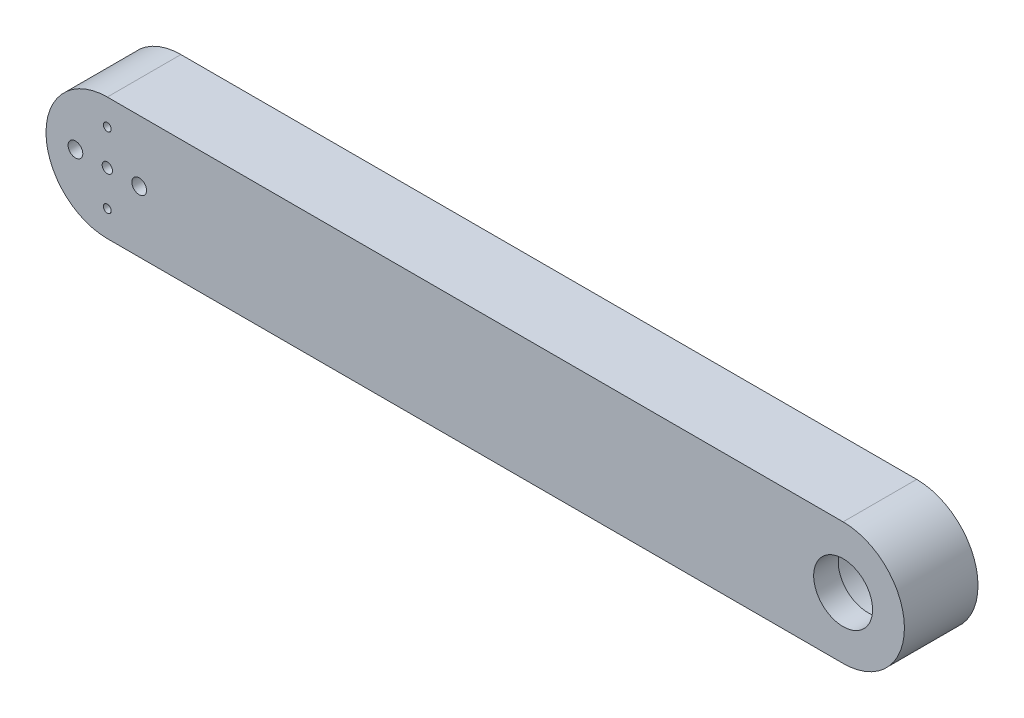
ISO-10303-21;
HEADER;
FILE_DESCRIPTION(('STEP AP214'),'2;1');
FILE_NAME('part.step','',(''),(''),'','','');
FILE_SCHEMA(('AUTOMOTIVE_DESIGN { 1 0 10303 214 1 1 1 1 }'));
ENDSEC;
DATA;
#1=APPLICATION_CONTEXT('core data for automotive mechanical design processes');
#2=APPLICATION_PROTOCOL_DEFINITION('international standard','automotive_design',2000,#1);
#3=PRODUCT_CONTEXT('',#1,'mechanical');
#4=PRODUCT('Part','Part','',(#3));
#5=PRODUCT_RELATED_PRODUCT_CATEGORY('part','',(#4));
#6=PRODUCT_DEFINITION_FORMATION('','',#4);
#7=PRODUCT_DEFINITION_CONTEXT('part definition',#1,'design');
#8=PRODUCT_DEFINITION('design','',#6,#7);
#9=PRODUCT_DEFINITION_SHAPE('','',#8);
#10=(LENGTH_UNIT() NAMED_UNIT(*) SI_UNIT(.MILLI.,.METRE.));
#11=(NAMED_UNIT(*) PLANE_ANGLE_UNIT() SI_UNIT($,.RADIAN.));
#12=(NAMED_UNIT(*) SI_UNIT($,.STERADIAN.) SOLID_ANGLE_UNIT());
#13=UNCERTAINTY_MEASURE_WITH_UNIT(LENGTH_MEASURE(1.E-05),#10,'distance_accuracy_value','');
#14=(GEOMETRIC_REPRESENTATION_CONTEXT(3) GLOBAL_UNCERTAINTY_ASSIGNED_CONTEXT((#13)) GLOBAL_UNIT_ASSIGNED_CONTEXT((#10,
#11,#12)) REPRESENTATION_CONTEXT('',''));
#15=CARTESIAN_POINT('',(0.,0.,0.));
#16=DIRECTION('',(0.,0.,1.));
#17=DIRECTION('',(1.,0.,0.));
#18=AXIS2_PLACEMENT_3D('',#15,#16,#17);
#19=CARTESIAN_POINT('',(-75.,0.,15.));
#20=DIRECTION('',(0.,0.,-1.));
#21=DIRECTION('',(-1.,0.,0.));
#22=AXIS2_PLACEMENT_3D('',#19,#20,#21);
#23=CYLINDRICAL_SURFACE('',#22,12.5);
#24=CARTESIAN_POINT('',(-75.,0.,0.));
#25=DIRECTION('',(0.,0.,1.));
#26=DIRECTION('',(1.,0.,0.));
#27=AXIS2_PLACEMENT_3D('',#24,#25,#26);
#28=CIRCLE('',#27,12.5);
#29=CARTESIAN_POINT('',(-75.,12.5,0.));
#30=VERTEX_POINT('',#29);
#31=CARTESIAN_POINT('',(-75.,-12.5,0.));
#32=VERTEX_POINT('',#31);
#33=EDGE_CURVE('E113',#30,#32,#28,.T.);
#34=ORIENTED_EDGE('',*,*,#33,.T.);
#35=DIRECTION('',(0.,0.,-1.));
#36=VECTOR('',#35,1.);
#37=CARTESIAN_POINT('',(-75.,-12.5,15.));
#38=LINE('',#37,#36);
#39=CARTESIAN_POINT('',(-75.,-12.5,15.));
#40=VERTEX_POINT('',#39);
#41=EDGE_CURVE('E11',#40,#32,#38,.T.);
#42=ORIENTED_EDGE('',*,*,#41,.F.);
#43=CARTESIAN_POINT('',(-75.,0.,15.));
#44=DIRECTION('',(0.,0.,1.));
#45=DIRECTION('',(1.,0.,0.));
#46=AXIS2_PLACEMENT_3D('',#43,#44,#45);
#47=CIRCLE('',#46,12.5);
#48=CARTESIAN_POINT('',(-75.,12.5,15.));
#49=VERTEX_POINT('',#48);
#50=EDGE_CURVE('E95',#49,#40,#47,.T.);
#51=ORIENTED_EDGE('',*,*,#50,.F.);
#52=DIRECTION('',(0.,0.,-1.));
#53=VECTOR('',#52,1.);
#54=CARTESIAN_POINT('',(-75.,12.5,15.));
#55=LINE('',#54,#53);
#56=EDGE_CURVE('E62',#49,#30,#55,.T.);
#57=ORIENTED_EDGE('',*,*,#56,.T.);
#58=EDGE_LOOP('',(#34,#42,#51,#57));
#59=FACE_BOUND('',#58,.T.);
#60=ADVANCED_FACE('F43',(#59),#23,.T.);
#61=CARTESIAN_POINT('',(0.,-12.5,15.));
#62=DIRECTION('',(0.,1.,0.));
#63=DIRECTION('',(0.,0.,1.));
#64=AXIS2_PLACEMENT_3D('',#61,#62,#63);
#65=PLANE('',#64);
#66=DIRECTION('',(1.,0.,0.));
#67=VECTOR('',#66,1.);
#68=CARTESIAN_POINT('',(0.,-12.5,0.));
#69=LINE('',#68,#67);
#70=CARTESIAN_POINT('',(75.,-12.5,0.));
#71=VERTEX_POINT('',#70);
#72=EDGE_CURVE('E100',#32,#71,#69,.T.);
#73=ORIENTED_EDGE('',*,*,#72,.T.);
#74=DIRECTION('',(0.,0.,-1.));
#75=VECTOR('',#74,1.);
#76=CARTESIAN_POINT('',(75.,-12.5,15.));
#77=LINE('',#76,#75);
#78=CARTESIAN_POINT('',(75.,-12.5,15.));
#79=VERTEX_POINT('',#78);
#80=EDGE_CURVE('E53',#79,#71,#77,.T.);
#81=ORIENTED_EDGE('',*,*,#80,.F.);
#82=DIRECTION('',(1.,0.,0.));
#83=VECTOR('',#82,1.);
#84=CARTESIAN_POINT('',(0.,-12.5,15.));
#85=LINE('',#84,#83);
#86=EDGE_CURVE('E88',#40,#79,#85,.T.);
#87=ORIENTED_EDGE('',*,*,#86,.F.);
#88=ORIENTED_EDGE('',*,*,#41,.T.);
#89=EDGE_LOOP('',(#73,#81,#87,#88));
#90=FACE_BOUND('',#89,.T.);
#91=ADVANCED_FACE('F99',(#90),#65,.F.);
#92=CARTESIAN_POINT('',(75.,0.,15.));
#93=DIRECTION('',(0.,0.,-1.));
#94=DIRECTION('',(-1.,0.,0.));
#95=AXIS2_PLACEMENT_3D('',#92,#93,#94);
#96=CYLINDRICAL_SURFACE('',#95,12.5);
#97=CARTESIAN_POINT('',(75.,0.,0.));
#98=DIRECTION('',(0.,0.,1.));
#99=DIRECTION('',(1.,0.,0.));
#100=AXIS2_PLACEMENT_3D('',#97,#98,#99);
#101=CIRCLE('',#100,12.5);
#102=CARTESIAN_POINT('',(75.,12.5,0.));
#103=VERTEX_POINT('',#102);
#104=EDGE_CURVE('E117',#71,#103,#101,.T.);
#105=ORIENTED_EDGE('',*,*,#104,.T.);
#106=DIRECTION('',(0.,0.,-1.));
#107=VECTOR('',#106,1.);
#108=CARTESIAN_POINT('',(75.,12.5,15.));
#109=LINE('',#108,#107);
#110=CARTESIAN_POINT('',(75.,12.5,15.));
#111=VERTEX_POINT('',#110);
#112=EDGE_CURVE('E77',#111,#103,#109,.T.);
#113=ORIENTED_EDGE('',*,*,#112,.F.);
#114=CARTESIAN_POINT('',(75.,0.,15.));
#115=DIRECTION('',(0.,0.,1.));
#116=DIRECTION('',(1.,0.,0.));
#117=AXIS2_PLACEMENT_3D('',#114,#115,#116);
#118=CIRCLE('',#117,12.5);
#119=EDGE_CURVE('E94',#79,#111,#118,.T.);
#120=ORIENTED_EDGE('',*,*,#119,.F.);
#121=ORIENTED_EDGE('',*,*,#80,.T.);
#122=EDGE_LOOP('',(#105,#113,#120,#121));
#123=FACE_BOUND('',#122,.T.);
#124=ADVANCED_FACE('F104',(#123),#96,.T.);
#125=CARTESIAN_POINT('',(-75.,0.,15.));
#126=DIRECTION('',(0.,0.,-1.));
#127=DIRECTION('',(-1.,0.,0.));
#128=AXIS2_PLACEMENT_3D('',#125,#126,#127);
#129=CYLINDRICAL_SURFACE('',#128,1.04999999999999);
#130=CARTESIAN_POINT('',(-75.,0.,15.));
#131=DIRECTION('',(0.,0.,1.));
#132=DIRECTION('',(1.,0.,0.));
#133=AXIS2_PLACEMENT_3D('',#130,#131,#132);
#134=CIRCLE('',#133,1.04999999999999);
#135=CARTESIAN_POINT('',(-73.95,0.,15.));
#136=VERTEX_POINT('',#135);
#137=EDGE_CURVE('E122',#136,#136,#134,.T.);
#138=ORIENTED_EDGE('',*,*,#137,.T.);
#139=EDGE_LOOP('',(#138));
#140=FACE_BOUND('',#139,.T.);
#141=CARTESIAN_POINT('',(-75.,0.,0.));
#142=DIRECTION('',(0.,0.,1.));
#143=DIRECTION('',(1.,0.,0.));
#144=AXIS2_PLACEMENT_3D('',#141,#142,#143);
#145=CIRCLE('',#144,1.04999999999999);
#146=CARTESIAN_POINT('',(-73.95,0.,0.));
#147=VERTEX_POINT('',#146);
#148=EDGE_CURVE('E110',#147,#147,#145,.T.);
#149=ORIENTED_EDGE('',*,*,#148,.F.);
#150=EDGE_LOOP('',(#149));
#151=FACE_BOUND('',#150,.T.);
#152=ADVANCED_FACE('F45',(#140,#151),#129,.F.);
#153=CARTESIAN_POINT('',(0.,12.5,15.));
#154=DIRECTION('',(0.,1.,0.));
#155=DIRECTION('',(0.,0.,1.));
#156=AXIS2_PLACEMENT_3D('',#153,#154,#155);
#157=PLANE('',#156);
#158=DIRECTION('',(1.,0.,0.));
#159=VECTOR('',#158,1.);
#160=CARTESIAN_POINT('',(0.,12.5,0.));
#161=LINE('',#160,#159);
#162=EDGE_CURVE('E119',#30,#103,#161,.T.);
#163=ORIENTED_EDGE('',*,*,#162,.F.);
#164=ORIENTED_EDGE('',*,*,#56,.F.);
#165=DIRECTION('',(1.,0.,0.));
#166=VECTOR('',#165,1.);
#167=CARTESIAN_POINT('',(0.,12.5,15.));
#168=LINE('',#167,#166);
#169=EDGE_CURVE('E105',#49,#111,#168,.T.);
#170=ORIENTED_EDGE('',*,*,#169,.T.);
#171=ORIENTED_EDGE('',*,*,#112,.T.);
#172=EDGE_LOOP('',(#163,#164,#170,#171));
#173=FACE_BOUND('',#172,.T.);
#174=ADVANCED_FACE('F158',(#173),#157,.T.);
#175=CARTESIAN_POINT('',(0.,0.,15.));
#176=DIRECTION('',(0.,0.,1.));
#177=DIRECTION('',(1.,0.,0.));
#178=AXIS2_PLACEMENT_3D('',#175,#176,#177);
#179=PLANE('',#178);
#180=CARTESIAN_POINT('',(-75.,7.2,15.));
#181=DIRECTION('',(0.,0.,1.));
#182=DIRECTION('',(1.,0.,0.));
#183=AXIS2_PLACEMENT_3D('',#180,#181,#182);
#184=CIRCLE('',#183,0.799999999999995);
#185=CARTESIAN_POINT('',(-74.2,7.2,15.));
#186=VERTEX_POINT('',#185);
#187=EDGE_CURVE('E171',#186,#186,#184,.T.);
#188=ORIENTED_EDGE('',*,*,#187,.F.);
#189=EDGE_LOOP('',(#188));
#190=FACE_BOUND('',#189,.T.);
#191=CARTESIAN_POINT('',(-75.,-7.2,15.));
#192=DIRECTION('',(0.,0.,1.));
#193=DIRECTION('',(1.,0.,0.));
#194=AXIS2_PLACEMENT_3D('',#191,#192,#193);
#195=CIRCLE('',#194,0.799999999999995);
#196=CARTESIAN_POINT('',(-74.2,-7.2,15.));
#197=VERTEX_POINT('',#196);
#198=EDGE_CURVE('E175',#197,#197,#195,.T.);
#199=ORIENTED_EDGE('',*,*,#198,.F.);
#200=EDGE_LOOP('',(#199));
#201=FACE_BOUND('',#200,.T.);
#202=CARTESIAN_POINT('',(75.,0.,15.));
#203=DIRECTION('',(0.,0.,1.));
#204=DIRECTION('',(1.,0.,0.));
#205=AXIS2_PLACEMENT_3D('',#202,#203,#204);
#206=CIRCLE('',#205,6.);
#207=CARTESIAN_POINT('',(81.,0.,15.));
#208=VERTEX_POINT('',#207);
#209=EDGE_CURVE('E179',#208,#208,#206,.F.);
#210=ORIENTED_EDGE('',*,*,#209,.T.);
#211=EDGE_LOOP('',(#210));
#212=FACE_BOUND('',#211,.T.);
#213=CARTESIAN_POINT('',(-68.5,0.,15.));
#214=DIRECTION('',(0.,0.,1.));
#215=DIRECTION('',(1.,0.,0.));
#216=AXIS2_PLACEMENT_3D('',#213,#214,#215);
#217=CIRCLE('',#216,1.5);
#218=CARTESIAN_POINT('',(-67.,0.,15.));
#219=VERTEX_POINT('',#218);
#220=EDGE_CURVE('E127',#219,#219,#217,.T.);
#221=ORIENTED_EDGE('',*,*,#220,.F.);
#222=EDGE_LOOP('',(#221));
#223=FACE_BOUND('',#222,.T.);
#224=CARTESIAN_POINT('',(-81.5,0.,15.));
#225=DIRECTION('',(0.,0.,1.));
#226=DIRECTION('',(1.,0.,0.));
#227=AXIS2_PLACEMENT_3D('',#224,#225,#226);
#228=CIRCLE('',#227,1.5);
#229=CARTESIAN_POINT('',(-80.,0.,15.));
#230=VERTEX_POINT('',#229);
#231=EDGE_CURVE('E185',#230,#230,#228,.T.);
#232=ORIENTED_EDGE('',*,*,#231,.F.);
#233=EDGE_LOOP('',(#232));
#234=FACE_BOUND('',#233,.T.);
#235=ORIENTED_EDGE('',*,*,#137,.F.);
#236=EDGE_LOOP('',(#235));
#237=FACE_BOUND('',#236,.T.);
#238=ORIENTED_EDGE('',*,*,#50,.T.);
#239=ORIENTED_EDGE('',*,*,#86,.T.);
#240=ORIENTED_EDGE('',*,*,#119,.T.);
#241=ORIENTED_EDGE('',*,*,#169,.F.);
#242=EDGE_LOOP('',(#238,#239,#240,#241));
#243=FACE_BOUND('',#242,.T.);
#244=ADVANCED_FACE('F91',(#190,#201,#212,#223,#234,#237,#243),#179,.T.);
#245=CARTESIAN_POINT('',(0.,0.,0.));
#246=DIRECTION('',(0.,0.,1.));
#247=DIRECTION('',(1.,0.,0.));
#248=AXIS2_PLACEMENT_3D('',#245,#246,#247);
#249=PLANE('',#248);
#250=CARTESIAN_POINT('',(-75.,7.2,0.));
#251=DIRECTION('',(0.,0.,1.));
#252=DIRECTION('',(1.,0.,0.));
#253=AXIS2_PLACEMENT_3D('',#250,#251,#252);
#254=CIRCLE('',#253,0.799999999999995);
#255=CARTESIAN_POINT('',(-74.2,7.2,0.));
#256=VERTEX_POINT('',#255);
#257=EDGE_CURVE('E204',#256,#256,#254,.T.);
#258=ORIENTED_EDGE('',*,*,#257,.T.);
#259=EDGE_LOOP('',(#258));
#260=FACE_BOUND('',#259,.T.);
#261=CARTESIAN_POINT('',(-75.,-7.2,0.));
#262=DIRECTION('',(0.,0.,1.));
#263=DIRECTION('',(1.,0.,0.));
#264=AXIS2_PLACEMENT_3D('',#261,#262,#263);
#265=CIRCLE('',#264,0.799999999999995);
#266=CARTESIAN_POINT('',(-74.2,-7.2,0.));
#267=VERTEX_POINT('',#266);
#268=EDGE_CURVE('E200',#267,#267,#265,.T.);
#269=ORIENTED_EDGE('',*,*,#268,.T.);
#270=EDGE_LOOP('',(#269));
#271=FACE_BOUND('',#270,.T.);
#272=CARTESIAN_POINT('',(75.,0.,0.));
#273=DIRECTION('',(0.,0.,1.));
#274=DIRECTION('',(1.,0.,0.));
#275=AXIS2_PLACEMENT_3D('',#272,#273,#274);
#276=CIRCLE('',#275,9.49999999999999);
#277=CARTESIAN_POINT('',(84.5,0.,0.));
#278=VERTEX_POINT('',#277);
#279=EDGE_CURVE('E194',#278,#278,#276,.T.);
#280=ORIENTED_EDGE('',*,*,#279,.T.);
#281=EDGE_LOOP('',(#280));
#282=FACE_BOUND('',#281,.T.);
#283=CARTESIAN_POINT('',(-68.5,0.,0.));
#284=DIRECTION('',(0.,0.,1.));
#285=DIRECTION('',(1.,0.,0.));
#286=AXIS2_PLACEMENT_3D('',#283,#284,#285);
#287=CIRCLE('',#286,1.5);
#288=CARTESIAN_POINT('',(-67.,0.,0.));
#289=VERTEX_POINT('',#288);
#290=EDGE_CURVE('E114',#289,#289,#287,.T.);
#291=ORIENTED_EDGE('',*,*,#290,.T.);
#292=EDGE_LOOP('',(#291));
#293=FACE_BOUND('',#292,.T.);
#294=CARTESIAN_POINT('',(-81.5,0.,0.));
#295=DIRECTION('',(0.,0.,1.));
#296=DIRECTION('',(1.,0.,0.));
#297=AXIS2_PLACEMENT_3D('',#294,#295,#296);
#298=CIRCLE('',#297,1.5);
#299=CARTESIAN_POINT('',(-80.,0.,0.));
#300=VERTEX_POINT('',#299);
#301=EDGE_CURVE('E125',#300,#300,#298,.T.);
#302=ORIENTED_EDGE('',*,*,#301,.T.);
#303=EDGE_LOOP('',(#302));
#304=FACE_BOUND('',#303,.T.);
#305=ORIENTED_EDGE('',*,*,#148,.T.);
#306=EDGE_LOOP('',(#305));
#307=FACE_BOUND('',#306,.T.);
#308=ORIENTED_EDGE('',*,*,#33,.F.);
#309=ORIENTED_EDGE('',*,*,#162,.T.);
#310=ORIENTED_EDGE('',*,*,#104,.F.);
#311=ORIENTED_EDGE('',*,*,#72,.F.);
#312=EDGE_LOOP('',(#308,#309,#310,#311));
#313=FACE_BOUND('',#312,.T.);
#314=ADVANCED_FACE('F131',(#260,#271,#282,#293,#304,#307,#313),#249,.F.);
#315=CARTESIAN_POINT('',(-81.5,0.,-1.2E-05));
#316=DIRECTION('',(0.,0.,1.));
#317=DIRECTION('',(1.,0.,0.));
#318=AXIS2_PLACEMENT_3D('',#315,#316,#317);
#319=CYLINDRICAL_SURFACE('',#318,1.5);
#320=CARTESIAN_POINT('',(-80.,0.,15.));
#321=CARTESIAN_POINT('',(-80.,0.,14.84375));
#322=CARTESIAN_POINT('',(-80.,0.,14.6875));
#323=CARTESIAN_POINT('',(-80.,0.,14.375));
#324=CARTESIAN_POINT('',(-80.,0.,14.21875));
#325=CARTESIAN_POINT('',(-80.,0.,13.90625));
#326=CARTESIAN_POINT('',(-80.,0.,13.75));
#327=CARTESIAN_POINT('',(-80.,0.,13.4375));
#328=CARTESIAN_POINT('',(-80.,0.,13.28125));
#329=CARTESIAN_POINT('',(-80.,0.,12.96875));
#330=CARTESIAN_POINT('',(-80.,0.,12.8125));
#331=CARTESIAN_POINT('',(-80.,0.,12.5));
#332=CARTESIAN_POINT('',(-80.,0.,12.34375));
#333=CARTESIAN_POINT('',(-80.,0.,12.03125));
#334=CARTESIAN_POINT('',(-80.,0.,11.875));
#335=CARTESIAN_POINT('',(-80.,0.,11.5625));
#336=CARTESIAN_POINT('',(-80.,0.,11.40625));
#337=CARTESIAN_POINT('',(-80.,0.,11.09375));
#338=CARTESIAN_POINT('',(-80.,0.,10.9375));
#339=CARTESIAN_POINT('',(-80.,0.,10.625));
#340=CARTESIAN_POINT('',(-80.,0.,10.46875));
#341=CARTESIAN_POINT('',(-80.,0.,10.15625));
#342=CARTESIAN_POINT('',(-80.,0.,10.));
#343=CARTESIAN_POINT('',(-80.,0.,9.6875));
#344=CARTESIAN_POINT('',(-80.,0.,9.53125));
#345=CARTESIAN_POINT('',(-80.,0.,9.21875));
#346=CARTESIAN_POINT('',(-80.,0.,9.0625));
#347=CARTESIAN_POINT('',(-80.,0.,8.75));
#348=CARTESIAN_POINT('',(-80.,0.,8.59375));
#349=CARTESIAN_POINT('',(-80.,0.,8.28125));
#350=CARTESIAN_POINT('',(-80.,0.,8.125));
#351=CARTESIAN_POINT('',(-80.,0.,7.8125));
#352=CARTESIAN_POINT('',(-80.,0.,7.65625));
#353=CARTESIAN_POINT('',(-80.,0.,7.34375));
#354=CARTESIAN_POINT('',(-80.,0.,7.1875));
#355=CARTESIAN_POINT('',(-80.,0.,6.875));
#356=CARTESIAN_POINT('',(-80.,0.,6.71875));
#357=CARTESIAN_POINT('',(-80.,0.,6.40625));
#358=CARTESIAN_POINT('',(-80.,0.,6.25));
#359=CARTESIAN_POINT('',(-80.,0.,5.9375));
#360=CARTESIAN_POINT('',(-80.,0.,5.78125));
#361=CARTESIAN_POINT('',(-80.,0.,5.46875));
#362=CARTESIAN_POINT('',(-80.,0.,5.3125));
#363=CARTESIAN_POINT('',(-80.,0.,5.));
#364=CARTESIAN_POINT('',(-80.,0.,4.84375));
#365=CARTESIAN_POINT('',(-80.,0.,4.53125));
#366=CARTESIAN_POINT('',(-80.,0.,4.375));
#367=CARTESIAN_POINT('',(-80.,0.,4.0625));
#368=CARTESIAN_POINT('',(-80.,0.,3.90625));
#369=CARTESIAN_POINT('',(-80.,0.,3.59375));
#370=CARTESIAN_POINT('',(-80.,0.,3.4375));
#371=CARTESIAN_POINT('',(-80.,0.,3.125));
#372=CARTESIAN_POINT('',(-80.,0.,2.96875));
#373=CARTESIAN_POINT('',(-80.,0.,2.65625));
#374=CARTESIAN_POINT('',(-80.,0.,2.5));
#375=CARTESIAN_POINT('',(-80.,0.,2.1875));
#376=CARTESIAN_POINT('',(-80.,0.,2.03125));
#377=CARTESIAN_POINT('',(-80.,0.,1.71875));
#378=CARTESIAN_POINT('',(-80.,0.,1.5625));
#379=CARTESIAN_POINT('',(-80.,0.,1.25));
#380=CARTESIAN_POINT('',(-80.,0.,1.09375));
#381=CARTESIAN_POINT('',(-80.,0.,0.781250000000001));
#382=CARTESIAN_POINT('',(-80.,0.,0.625000000000001));
#383=CARTESIAN_POINT('',(-80.,0.,0.312500000000001));
#384=CARTESIAN_POINT('',(-80.,0.,0.156250000000001));
#385=CARTESIAN_POINT('',(-80.,0.,0.));
#386=B_SPLINE_CURVE_WITH_KNOTS('',3,(#320,#321,#322,#323,#324,#325,#326,#327,#328,#329,#330,
#331,#332,#333,#334,#335,#336,#337,#338,#339,#340,#341,#342,#343,#344,#345,#346,#347,#348,#349,
#350,#351,#352,#353,#354,#355,#356,#357,#358,#359,#360,#361,#362,#363,#364,#365,#366,#367,#368,
#369,#370,#371,#372,#373,#374,#375,#376,#377,#378,#379,#380,#381,#382,#383,#384,#385),
.UNSPECIFIED.,.F.,.F.,(4,2,2,2,2,2,2,2,2,2,2,2,2,2,2,2,2,2,2,2,2,2,2,2,2,2,2,2,2,2,2,2,4),(0.,
0.46875,0.937500000000001,1.40625,1.875,2.34375,2.8125,3.28125,3.75,4.21875,4.6875,5.15625,
5.625,6.09375,6.5625,7.03125,7.5,7.96875,8.4375,8.90625,9.375,9.84375,10.3125,10.78125,11.25,
11.71875,12.1875,12.65625,13.125,13.59375,14.0625,14.53125,15.),.UNSPECIFIED.);
#387=EDGE_CURVE('BSEAM137',#230,#300,#386,.T.);
#388=ORIENTED_EDGE('',*,*,#231,.T.);
#389=ORIENTED_EDGE('',*,*,#301,.F.);
#390=ORIENTED_EDGE('',*,*,#387,.T.);
#391=ORIENTED_EDGE('',*,*,#387,.F.);
#392=EDGE_LOOP('',(#388,#390,#389,#391));
#393=FACE_BOUND('',#392,.T.);
#394=ADVANCED_FACE('F137',(#393),#319,.F.);
#395=CARTESIAN_POINT('',(-68.5,0.,-1.2E-05));
#396=DIRECTION('',(0.,0.,1.));
#397=DIRECTION('',(1.,0.,0.));
#398=AXIS2_PLACEMENT_3D('',#395,#396,#397);
#399=CYLINDRICAL_SURFACE('',#398,1.5);
#400=CARTESIAN_POINT('',(-67.,0.,15.));
#401=CARTESIAN_POINT('',(-67.,0.,14.84375));
#402=CARTESIAN_POINT('',(-67.,0.,14.6875));
#403=CARTESIAN_POINT('',(-67.,0.,14.375));
#404=CARTESIAN_POINT('',(-67.,0.,14.21875));
#405=CARTESIAN_POINT('',(-67.,0.,13.90625));
#406=CARTESIAN_POINT('',(-67.,0.,13.75));
#407=CARTESIAN_POINT('',(-67.,0.,13.4375));
#408=CARTESIAN_POINT('',(-67.,0.,13.28125));
#409=CARTESIAN_POINT('',(-67.,0.,12.96875));
#410=CARTESIAN_POINT('',(-67.,0.,12.8125));
#411=CARTESIAN_POINT('',(-67.,0.,12.5));
#412=CARTESIAN_POINT('',(-67.,0.,12.34375));
#413=CARTESIAN_POINT('',(-67.,0.,12.03125));
#414=CARTESIAN_POINT('',(-67.,0.,11.875));
#415=CARTESIAN_POINT('',(-67.,0.,11.5625));
#416=CARTESIAN_POINT('',(-67.,0.,11.40625));
#417=CARTESIAN_POINT('',(-67.,0.,11.09375));
#418=CARTESIAN_POINT('',(-67.,0.,10.9375));
#419=CARTESIAN_POINT('',(-67.,0.,10.625));
#420=CARTESIAN_POINT('',(-67.,0.,10.46875));
#421=CARTESIAN_POINT('',(-67.,0.,10.15625));
#422=CARTESIAN_POINT('',(-67.,0.,10.));
#423=CARTESIAN_POINT('',(-67.,0.,9.6875));
#424=CARTESIAN_POINT('',(-67.,0.,9.53125));
#425=CARTESIAN_POINT('',(-67.,0.,9.21875));
#426=CARTESIAN_POINT('',(-67.,0.,9.0625));
#427=CARTESIAN_POINT('',(-67.,0.,8.75));
#428=CARTESIAN_POINT('',(-67.,0.,8.59375));
#429=CARTESIAN_POINT('',(-67.,0.,8.28125));
#430=CARTESIAN_POINT('',(-67.,0.,8.125));
#431=CARTESIAN_POINT('',(-67.,0.,7.8125));
#432=CARTESIAN_POINT('',(-67.,0.,7.65625));
#433=CARTESIAN_POINT('',(-67.,0.,7.34375));
#434=CARTESIAN_POINT('',(-67.,0.,7.1875));
#435=CARTESIAN_POINT('',(-67.,0.,6.875));
#436=CARTESIAN_POINT('',(-67.,0.,6.71875));
#437=CARTESIAN_POINT('',(-67.,0.,6.40625));
#438=CARTESIAN_POINT('',(-67.,0.,6.25));
#439=CARTESIAN_POINT('',(-67.,0.,5.9375));
#440=CARTESIAN_POINT('',(-67.,0.,5.78125));
#441=CARTESIAN_POINT('',(-67.,0.,5.46875));
#442=CARTESIAN_POINT('',(-67.,0.,5.3125));
#443=CARTESIAN_POINT('',(-67.,0.,5.));
#444=CARTESIAN_POINT('',(-67.,0.,4.84375));
#445=CARTESIAN_POINT('',(-67.,0.,4.53125));
#446=CARTESIAN_POINT('',(-67.,0.,4.375));
#447=CARTESIAN_POINT('',(-67.,0.,4.0625));
#448=CARTESIAN_POINT('',(-67.,0.,3.90625));
#449=CARTESIAN_POINT('',(-67.,0.,3.59375));
#450=CARTESIAN_POINT('',(-67.,0.,3.4375));
#451=CARTESIAN_POINT('',(-67.,0.,3.125));
#452=CARTESIAN_POINT('',(-67.,0.,2.96875));
#453=CARTESIAN_POINT('',(-67.,0.,2.65625));
#454=CARTESIAN_POINT('',(-67.,0.,2.5));
#455=CARTESIAN_POINT('',(-67.,0.,2.1875));
#456=CARTESIAN_POINT('',(-67.,0.,2.03125));
#457=CARTESIAN_POINT('',(-67.,0.,1.71875));
#458=CARTESIAN_POINT('',(-67.,0.,1.5625));
#459=CARTESIAN_POINT('',(-67.,0.,1.25));
#460=CARTESIAN_POINT('',(-67.,0.,1.09375));
#461=CARTESIAN_POINT('',(-67.,0.,0.781250000000001));
#462=CARTESIAN_POINT('',(-67.,0.,0.625000000000001));
#463=CARTESIAN_POINT('',(-67.,0.,0.312500000000001));
#464=CARTESIAN_POINT('',(-67.,0.,0.156250000000001));
#465=CARTESIAN_POINT('',(-67.,0.,0.));
#466=B_SPLINE_CURVE_WITH_KNOTS('',3,(#400,#401,#402,#403,#404,#405,#406,#407,#408,#409,#410,
#411,#412,#413,#414,#415,#416,#417,#418,#419,#420,#421,#422,#423,#424,#425,#426,#427,#428,#429,
#430,#431,#432,#433,#434,#435,#436,#437,#438,#439,#440,#441,#442,#443,#444,#445,#446,#447,#448,
#449,#450,#451,#452,#453,#454,#455,#456,#457,#458,#459,#460,#461,#462,#463,#464,#465),
.UNSPECIFIED.,.F.,.F.,(4,2,2,2,2,2,2,2,2,2,2,2,2,2,2,2,2,2,2,2,2,2,2,2,2,2,2,2,2,2,2,2,4),(0.,
0.46875,0.937500000000001,1.40625,1.875,2.34375,2.8125,3.28125,3.75,4.21875,4.6875,5.15625,
5.625,6.09375,6.5625,7.03125,7.5,7.96875,8.4375,8.90625,9.375,9.84375,10.3125,10.78125,11.25,
11.71875,12.1875,12.65625,13.125,13.59375,14.0625,14.53125,15.),.UNSPECIFIED.);
#467=EDGE_CURVE('BSEAM134',#219,#289,#466,.T.);
#468=ORIENTED_EDGE('',*,*,#220,.T.);
#469=ORIENTED_EDGE('',*,*,#290,.F.);
#470=ORIENTED_EDGE('',*,*,#467,.T.);
#471=ORIENTED_EDGE('',*,*,#467,.F.);
#472=EDGE_LOOP('',(#468,#470,#469,#471));
#473=FACE_BOUND('',#472,.T.);
#474=ADVANCED_FACE('F134',(#473),#399,.F.);
#475=CARTESIAN_POINT('',(75.,0.,10.));
#476=DIRECTION('',(0.,0.,-1.));
#477=DIRECTION('',(-1.,0.,0.));
#478=AXIS2_PLACEMENT_3D('',#475,#476,#477);
#479=CYLINDRICAL_SURFACE('',#478,9.49999999999999);
#480=CARTESIAN_POINT('',(75.,0.,10.));
#481=DIRECTION('',(0.,0.,1.));
#482=DIRECTION('',(1.,0.,0.));
#483=AXIS2_PLACEMENT_3D('',#480,#481,#482);
#484=CIRCLE('',#483,9.49999999999999);
#485=CARTESIAN_POINT('',(84.5,0.,10.));
#486=VERTEX_POINT('',#485);
#487=EDGE_CURVE('E192',#486,#486,#484,.T.);
#488=ORIENTED_EDGE('',*,*,#487,.T.);
#489=EDGE_LOOP('',(#488));
#490=FACE_BOUND('',#489,.T.);
#491=ORIENTED_EDGE('',*,*,#279,.F.);
#492=EDGE_LOOP('',(#491));
#493=FACE_BOUND('',#492,.T.);
#494=ADVANCED_FACE('F136',(#490,#493),#479,.F.);
#495=CARTESIAN_POINT('',(75.,0.,10.));
#496=DIRECTION('',(0.,0.,1.));
#497=DIRECTION('',(1.,0.,0.));
#498=AXIS2_PLACEMENT_3D('',#495,#496,#497);
#499=PLANE('',#498);
#500=CARTESIAN_POINT('',(75.,0.,10.));
#501=DIRECTION('',(0.,0.,1.));
#502=DIRECTION('',(1.,0.,0.));
#503=AXIS2_PLACEMENT_3D('',#500,#501,#502);
#504=CIRCLE('',#503,6.);
#505=CARTESIAN_POINT('',(81.,0.,10.));
#506=VERTEX_POINT('',#505);
#507=EDGE_CURVE('E47',#506,#506,#504,.F.);
#508=ORIENTED_EDGE('',*,*,#507,.F.);
#509=EDGE_LOOP('',(#508));
#510=FACE_BOUND('',#509,.T.);
#511=ORIENTED_EDGE('',*,*,#487,.F.);
#512=EDGE_LOOP('',(#511));
#513=FACE_BOUND('',#512,.T.);
#514=ADVANCED_FACE('F144',(#510,#513),#499,.F.);
#515=CARTESIAN_POINT('',(75.,0.,20.));
#516=DIRECTION('',(0.,0.,-1.));
#517=DIRECTION('',(-1.,0.,0.));
#518=AXIS2_PLACEMENT_3D('',#515,#516,#517);
#519=CYLINDRICAL_SURFACE('',#518,6.);
#520=ORIENTED_EDGE('',*,*,#209,.F.);
#521=EDGE_LOOP('',(#520));
#522=FACE_BOUND('',#521,.T.);
#523=ORIENTED_EDGE('',*,*,#507,.T.);
#524=EDGE_LOOP('',(#523));
#525=FACE_BOUND('',#524,.T.);
#526=ADVANCED_FACE('F216',(#522,#525),#519,.F.);
#527=CARTESIAN_POINT('',(-75.,-7.2,15.));
#528=DIRECTION('',(0.,0.,1.));
#529=DIRECTION('',(1.,0.,0.));
#530=AXIS2_PLACEMENT_3D('',#527,#528,#529);
#531=CYLINDRICAL_SURFACE('',#530,0.799999999999995);
#532=ORIENTED_EDGE('',*,*,#268,.F.);
#533=EDGE_LOOP('',(#532));
#534=FACE_BOUND('',#533,.T.);
#535=ORIENTED_EDGE('',*,*,#198,.T.);
#536=EDGE_LOOP('',(#535));
#537=FACE_BOUND('',#536,.T.);
#538=ADVANCED_FACE('F210',(#534,#537),#531,.F.);
#539=CARTESIAN_POINT('',(-75.,7.2,15.));
#540=DIRECTION('',(0.,0.,1.));
#541=DIRECTION('',(1.,0.,0.));
#542=AXIS2_PLACEMENT_3D('',#539,#540,#541);
#543=CYLINDRICAL_SURFACE('',#542,0.799999999999995);
#544=ORIENTED_EDGE('',*,*,#257,.F.);
#545=EDGE_LOOP('',(#544));
#546=FACE_BOUND('',#545,.T.);
#547=ORIENTED_EDGE('',*,*,#187,.T.);
#548=EDGE_LOOP('',(#547));
#549=FACE_BOUND('',#548,.T.);
#550=ADVANCED_FACE('F208',(#546,#549),#543,.F.);
#551=CLOSED_SHELL('',(#60,#91,#124,#152,#174,#244,#314,#394,#474,#494,#514,#526,#538,#550));
#552=MANIFOLD_SOLID_BREP('B2',#551);
#553=ADVANCED_BREP_SHAPE_REPRESENTATION('',(#18,#552),#14);
#554=SHAPE_DEFINITION_REPRESENTATION(#9,#553);
ENDSEC;
END-ISO-10303-21;
